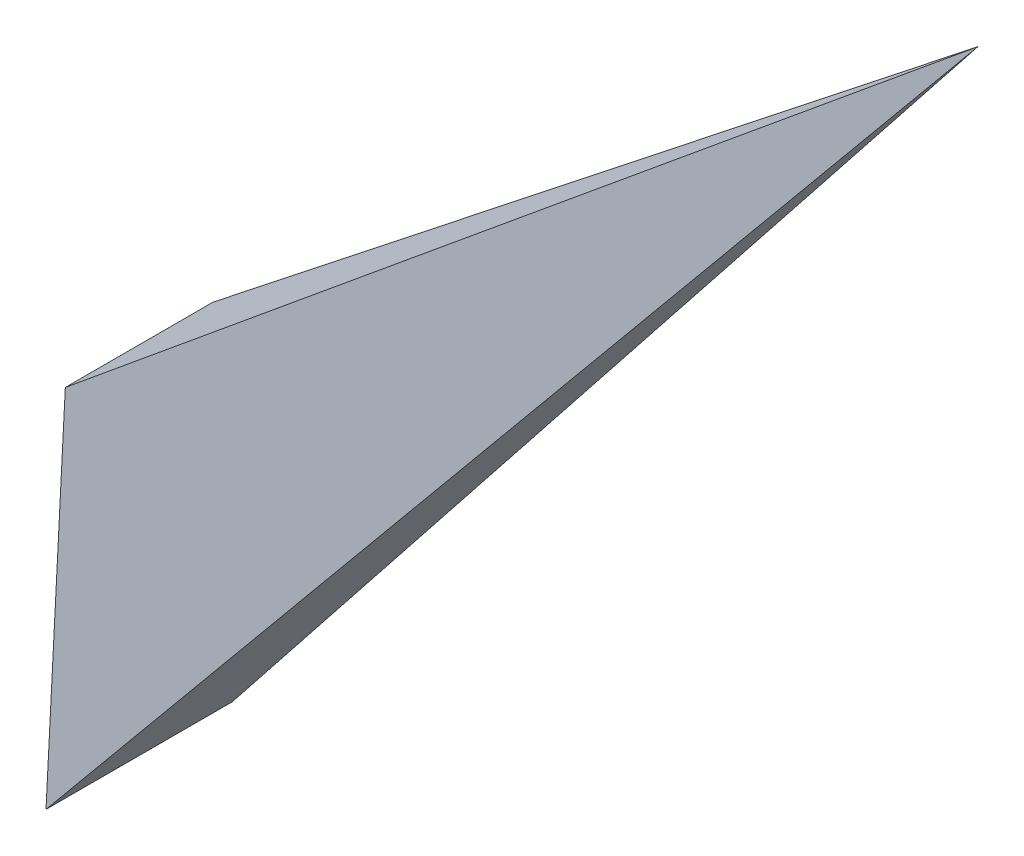
ISO-10303-21;
HEADER;
FILE_DESCRIPTION(('STEP AP214'),'2;1');
FILE_NAME('part.step','',(''),(''),'','','');
FILE_SCHEMA(('AUTOMOTIVE_DESIGN { 1 0 10303 214 1 1 1 1 }'));
ENDSEC;
DATA;
#1=APPLICATION_CONTEXT('core data for automotive mechanical design processes');
#2=APPLICATION_PROTOCOL_DEFINITION('international standard','automotive_design',2000,#1);
#3=PRODUCT_CONTEXT('',#1,'mechanical');
#4=PRODUCT('Part','Part','',(#3));
#5=PRODUCT_RELATED_PRODUCT_CATEGORY('part','',(#4));
#6=PRODUCT_DEFINITION_FORMATION('','',#4);
#7=PRODUCT_DEFINITION_CONTEXT('part definition',#1,'design');
#8=PRODUCT_DEFINITION('design','',#6,#7);
#9=PRODUCT_DEFINITION_SHAPE('','',#8);
#10=(LENGTH_UNIT() NAMED_UNIT(*) SI_UNIT(.MILLI.,.METRE.));
#11=(NAMED_UNIT(*) PLANE_ANGLE_UNIT() SI_UNIT($,.RADIAN.));
#12=(NAMED_UNIT(*) SI_UNIT($,.STERADIAN.) SOLID_ANGLE_UNIT());
#13=UNCERTAINTY_MEASURE_WITH_UNIT(LENGTH_MEASURE(1.E-05),#10,'distance_accuracy_value','');
#14=(GEOMETRIC_REPRESENTATION_CONTEXT(3) GLOBAL_UNCERTAINTY_ASSIGNED_CONTEXT((#13)) GLOBAL_UNIT_ASSIGNED_CONTEXT((#10,
#11,#12)) REPRESENTATION_CONTEXT('',''));
#15=CARTESIAN_POINT('',(0.,0.,0.));
#16=DIRECTION('',(0.,0.,1.));
#17=DIRECTION('',(1.,0.,0.));
#18=AXIS2_PLACEMENT_3D('',#15,#16,#17);
#19=CARTESIAN_POINT('',(-1194.28275076173,1473.63198425097,-508.));
#20=DIRECTION('',(-1.,0.,0.));
#21=DIRECTION('',(0.,0.,1.));
#22=AXIS2_PLACEMENT_3D('',#19,#20,#21);
#23=PLANE('',#22);
#24=DIRECTION('',(0.,0.,-1.));
#25=VECTOR('',#24,1.);
#26=CARTESIAN_POINT('',(-1194.28275076173,967.154967623569,-508.));
#27=LINE('',#26,#25);
#28=CARTESIAN_POINT('',(-1194.28275076173,967.154967623569,132.508508469212));
#29=VERTEX_POINT('',#28);
#30=CARTESIAN_POINT('',(-1194.28275076173,967.154967623569,-132.508508469212));
#31=VERTEX_POINT('',#30);
#32=EDGE_CURVE('E126',#29,#31,#27,.T.);
#33=ORIENTED_EDGE('',*,*,#32,.F.);
#34=DIRECTION('',(0.,0.998529487802831,-0.0542112717819508));
#35=VECTOR('',#34,1.);
#36=CARTESIAN_POINT('',(-1194.28275076173,1506.81523875744,103.209754666023));
#37=LINE('',#36,#35);
#38=CARTESIAN_POINT('',(-1194.28275076173,1473.63198425097,105.011310304223));
#39=VERTEX_POINT('',#38);
#40=EDGE_CURVE('E113',#29,#39,#37,.T.);
#41=ORIENTED_EDGE('',*,*,#40,.T.);
#42=DIRECTION('',(0.,0.,1.));
#43=VECTOR('',#42,1.);
#44=CARTESIAN_POINT('',(-1194.28275076173,1473.63198425097,-508.));
#45=LINE('',#44,#43);
#46=CARTESIAN_POINT('',(-1194.28275076173,1473.63198425097,-105.011310304223));
#47=VERTEX_POINT('',#46);
#48=EDGE_CURVE('E12',#47,#39,#45,.T.);
#49=ORIENTED_EDGE('',*,*,#48,.F.);
#50=DIRECTION('',(0.,0.998529487802831,0.0542112717819509));
#51=VECTOR('',#50,1.);
#52=CARTESIAN_POINT('',(-1194.28275076173,1451.81758045674,-106.195638446051));
#53=LINE('',#52,#51);
#54=EDGE_CURVE('E99',#31,#47,#53,.T.);
#55=ORIENTED_EDGE('',*,*,#54,.F.);
#56=EDGE_LOOP('',(#33,#41,#49,#55));
#57=FACE_BOUND('',#56,.T.);
#58=ADVANCED_FACE('F91',(#57),#23,.T.);
#59=CARTESIAN_POINT('',(0.,2438.4,-508.));
#60=DIRECTION('',(-0.628398214350031,0.777891820372018,0.));
#61=DIRECTION('',(-0.777891820372018,-0.628398214350031,0.));
#62=AXIS2_PLACEMENT_3D('',#59,#60,#61);
#63=PLANE('',#62);
#64=ORIENTED_EDGE('',*,*,#48,.T.);
#65=DIRECTION('',(0.776078540404365,0.626933406694328,-0.0682393046159892));
#66=VECTOR('',#65,1.);
#67=CARTESIAN_POINT('',(26.9032024416896,2460.13300185438,-2.36555416879281));
#68=LINE('',#67,#66);
#69=CARTESIAN_POINT('',(3.33066907387547E-13,2438.4,0.));
#70=VERTEX_POINT('',#69);
#71=EDGE_CURVE('E130',#39,#70,#68,.T.);
#72=ORIENTED_EDGE('',*,*,#71,.T.);
#73=DIRECTION('',(0.776078540404365,0.626933406694328,0.0682393046159893));
#74=VECTOR('',#73,1.);
#75=CARTESIAN_POINT('',(-26.9032024416896,2416.66699814562,-2.36555416879269));
#76=LINE('',#75,#74);
#77=EDGE_CURVE('E135',#47,#70,#76,.T.);
#78=ORIENTED_EDGE('',*,*,#77,.F.);
#79=EDGE_LOOP('',(#64,#72,#78));
#80=FACE_BOUND('',#79,.T.);
#81=ADVANCED_FACE('F141',(#80),#63,.T.);
#82=CARTESIAN_POINT('',(-989.685264987292,1219.2,-508.));
#83=DIRECTION('',(0.776399009318737,-0.630241682474972,0.));
#84=DIRECTION('',(0.630241682474972,0.776399009318738,0.));
#85=AXIS2_PLACEMENT_3D('',#82,#83,#84);
#86=PLANE('',#85);
#87=DIRECTION('',(-0.628706445412299,-0.774507740353715,-0.0697564737441181));
#88=VECTOR('',#87,1.);
#89=CARTESIAN_POINT('',(-1007.14851358742,1197.686905437,-111.745520277617));
#90=LINE('',#89,#88);
#91=EDGE_CURVE('E127',#70,#31,#90,.T.);
#92=ORIENTED_EDGE('',*,*,#91,.F.);
#93=DIRECTION('',(-0.628706445412299,-0.774507740353715,0.0697564737441181));
#94=VECTOR('',#93,1.);
#95=CARTESIAN_POINT('',(-962.590467420827,1252.57826515327,106.801699198336));
#96=LINE('',#95,#94);
#97=EDGE_CURVE('E125',#70,#29,#96,.T.);
#98=ORIENTED_EDGE('',*,*,#97,.T.);
#99=ORIENTED_EDGE('',*,*,#32,.T.);
#100=EDGE_LOOP('',(#92,#98,#99));
#101=FACE_BOUND('',#100,.T.);
#102=ADVANCED_FACE('F93',(#101),#86,.T.);
#103=CARTESIAN_POINT('',(-719.90817433996,3022.78526270354,0.));
#104=DIRECTION('',(-0.0439634373760142,-0.0541588571085019,0.997564050259825));
#105=DIRECTION('',(0.,-0.998529487802831,-0.0542112717819509));
#106=AXIS2_PLACEMENT_3D('',#103,#104,#105);
#107=PLANE('',#106);
#108=ORIENTED_EDGE('',*,*,#91,.T.);
#109=ORIENTED_EDGE('',*,*,#54,.T.);
#110=ORIENTED_EDGE('',*,*,#77,.T.);
#111=EDGE_LOOP('',(#108,#109,#110));
#112=FACE_BOUND('',#111,.T.);
#113=ADVANCED_FACE('F139',(#112),#107,.F.);
#114=CARTESIAN_POINT('',(-719.90817433996,3022.78526270354,0.));
#115=DIRECTION('',(0.0439634373760142,0.0541588571085018,0.997564050259825));
#116=DIRECTION('',(0.,-0.998529487802831,0.0542112717819508));
#117=AXIS2_PLACEMENT_3D('',#114,#115,#116);
#118=PLANE('',#117);
#119=ORIENTED_EDGE('',*,*,#40,.F.);
#120=ORIENTED_EDGE('',*,*,#97,.F.);
#121=ORIENTED_EDGE('',*,*,#71,.F.);
#122=EDGE_LOOP('',(#119,#120,#121));
#123=FACE_BOUND('',#122,.T.);
#124=ADVANCED_FACE('F133',(#123),#118,.T.);
#125=CLOSED_SHELL('',(#58,#81,#102,#113,#124));
#126=MANIFOLD_SOLID_BREP('B2',#125);
#127=ADVANCED_BREP_SHAPE_REPRESENTATION('',(#18,#126),#14);
#128=SHAPE_DEFINITION_REPRESENTATION(#9,#127);
ENDSEC;
END-ISO-10303-21;
